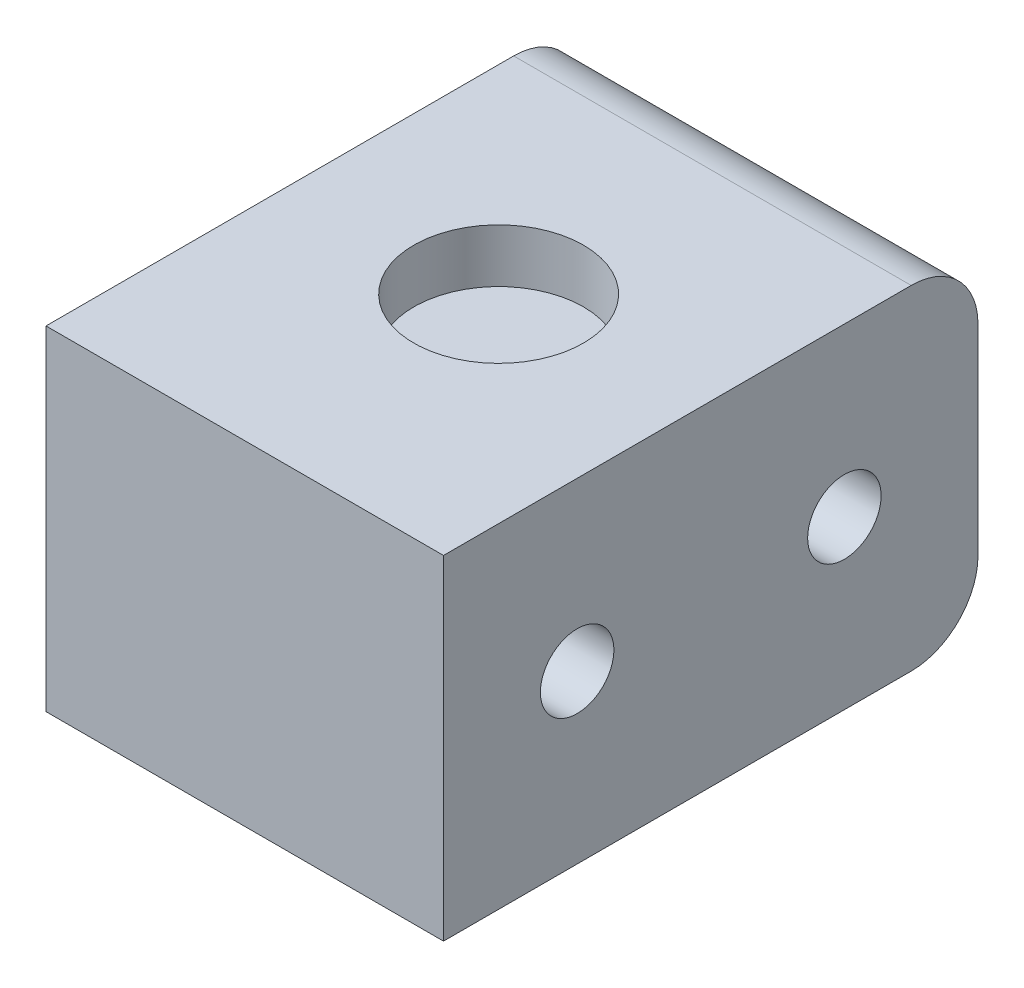
ISO-10303-21;
HEADER;
FILE_DESCRIPTION(('STEP AP214'),'2;1');
FILE_NAME('part.step','',(''),(''),'','','');
FILE_SCHEMA(('AUTOMOTIVE_DESIGN { 1 0 10303 214 1 1 1 1 }'));
ENDSEC;
DATA;
#1=APPLICATION_CONTEXT('core data for automotive mechanical design processes');
#2=APPLICATION_PROTOCOL_DEFINITION('international standard','automotive_design',2000,#1);
#3=PRODUCT_CONTEXT('',#1,'mechanical');
#4=PRODUCT('Part','Part','',(#3));
#5=PRODUCT_RELATED_PRODUCT_CATEGORY('part','',(#4));
#6=PRODUCT_DEFINITION_FORMATION('','',#4);
#7=PRODUCT_DEFINITION_CONTEXT('part definition',#1,'design');
#8=PRODUCT_DEFINITION('design','',#6,#7);
#9=PRODUCT_DEFINITION_SHAPE('','',#8);
#10=(LENGTH_UNIT() NAMED_UNIT(*) SI_UNIT(.MILLI.,.METRE.));
#11=(NAMED_UNIT(*) PLANE_ANGLE_UNIT() SI_UNIT($,.RADIAN.));
#12=(NAMED_UNIT(*) SI_UNIT($,.STERADIAN.) SOLID_ANGLE_UNIT());
#13=UNCERTAINTY_MEASURE_WITH_UNIT(LENGTH_MEASURE(1.E-05),#10,'distance_accuracy_value','');
#14=(GEOMETRIC_REPRESENTATION_CONTEXT(3) GLOBAL_UNCERTAINTY_ASSIGNED_CONTEXT((#13)) GLOBAL_UNIT_ASSIGNED_CONTEXT((#10,
#11,#12)) REPRESENTATION_CONTEXT('',''));
#15=CARTESIAN_POINT('',(0.,0.,0.));
#16=DIRECTION('',(0.,0.,1.));
#17=DIRECTION('',(1.,0.,0.));
#18=AXIS2_PLACEMENT_3D('',#15,#16,#17);
#19=CARTESIAN_POINT('',(0.,100.,0.));
#20=DIRECTION('',(1.,0.,0.));
#21=DIRECTION('',(0.,1.,0.));
#22=AXIS2_PLACEMENT_3D('',#19,#20,#21);
#23=PLANE('',#22);
#24=CARTESIAN_POINT('',(0.,87.5,-30.));
#25=DIRECTION('',(-1.,0.,0.));
#26=DIRECTION('',(0.,0.,1.));
#27=AXIS2_PLACEMENT_3D('',#24,#25,#26);
#28=CIRCLE('',#27,2.74999999999999);
#29=CARTESIAN_POINT('',(0.,87.5,-27.25));
#30=VERTEX_POINT('',#29);
#31=EDGE_CURVE('E160',#30,#30,#28,.T.);
#32=ORIENTED_EDGE('',*,*,#31,.T.);
#33=EDGE_LOOP('',(#32));
#34=FACE_BOUND('',#33,.T.);
#35=CARTESIAN_POINT('',(0.,87.5,-10.));
#36=DIRECTION('',(-1.,0.,0.));
#37=DIRECTION('',(0.,0.,1.));
#38=AXIS2_PLACEMENT_3D('',#35,#36,#37);
#39=CIRCLE('',#38,2.74999999999999);
#40=CARTESIAN_POINT('',(0.,87.5,-7.25000000000001));
#41=VERTEX_POINT('',#40);
#42=EDGE_CURVE('E154',#41,#41,#39,.T.);
#43=ORIENTED_EDGE('',*,*,#42,.T.);
#44=EDGE_LOOP('',(#43));
#45=FACE_BOUND('',#44,.T.);
#46=DIRECTION('',(0.,1.,0.));
#47=VECTOR('',#46,1.);
#48=CARTESIAN_POINT('',(0.,100.,-40.));
#49=LINE('',#48,#47);
#50=CARTESIAN_POINT('',(0.,80.,-40.));
#51=VERTEX_POINT('',#50);
#52=CARTESIAN_POINT('',(0.,95.,-40.));
#53=VERTEX_POINT('',#52);
#54=EDGE_CURVE('E137',#51,#53,#49,.T.);
#55=ORIENTED_EDGE('',*,*,#54,.T.);
#56=CARTESIAN_POINT('',(0.,95.,-35.));
#57=DIRECTION('',(-1.,0.,0.));
#58=DIRECTION('',(0.,1.,0.));
#59=AXIS2_PLACEMENT_3D('',#56,#57,#58);
#60=CIRCLE('',#59,5.);
#61=CARTESIAN_POINT('',(0.,100.,-35.));
#62=VERTEX_POINT('',#61);
#63=EDGE_CURVE('E110',#62,#53,#60,.T.);
#64=ORIENTED_EDGE('',*,*,#63,.F.);
#65=DIRECTION('',(0.,0.,-1.));
#66=VECTOR('',#65,1.);
#67=CARTESIAN_POINT('',(0.,100.,0.));
#68=LINE('',#67,#66);
#69=CARTESIAN_POINT('',(0.,100.,0.));
#70=VERTEX_POINT('',#69);
#71=EDGE_CURVE('E90',#70,#62,#68,.T.);
#72=ORIENTED_EDGE('',*,*,#71,.F.);
#73=DIRECTION('',(0.,1.,0.));
#74=VECTOR('',#73,1.);
#75=CARTESIAN_POINT('',(0.,100.,0.));
#76=LINE('',#75,#74);
#77=CARTESIAN_POINT('',(0.,75.,0.));
#78=VERTEX_POINT('',#77);
#79=EDGE_CURVE('E97',#78,#70,#76,.T.);
#80=ORIENTED_EDGE('',*,*,#79,.F.);
#81=DIRECTION('',(0.,0.,-1.));
#82=VECTOR('',#81,1.);
#83=CARTESIAN_POINT('',(0.,75.,0.));
#84=LINE('',#83,#82);
#85=CARTESIAN_POINT('',(0.,75.,-35.));
#86=VERTEX_POINT('',#85);
#87=EDGE_CURVE('E120',#78,#86,#84,.T.);
#88=ORIENTED_EDGE('',*,*,#87,.T.);
#89=CARTESIAN_POINT('',(0.,80.,-35.));
#90=DIRECTION('',(-1.,0.,0.));
#91=DIRECTION('',(0.,1.,0.));
#92=AXIS2_PLACEMENT_3D('',#89,#90,#91);
#93=CIRCLE('',#92,5.);
#94=EDGE_CURVE('E123',#51,#86,#93,.T.);
#95=ORIENTED_EDGE('',*,*,#94,.F.);
#96=EDGE_LOOP('',(#55,#64,#72,#80,#88,#95));
#97=FACE_BOUND('',#96,.T.);
#98=ADVANCED_FACE('F36',(#34,#45,#97),#23,.T.);
#99=CARTESIAN_POINT('',(0.,75.,0.));
#100=DIRECTION('',(0.,-1.,0.));
#101=DIRECTION('',(0.,0.,1.));
#102=AXIS2_PLACEMENT_3D('',#99,#100,#101);
#103=PLANE('',#102);
#104=ORIENTED_EDGE('',*,*,#87,.F.);
#105=DIRECTION('',(1.,0.,0.));
#106=VECTOR('',#105,1.);
#107=CARTESIAN_POINT('',(0.,75.,0.));
#108=LINE('',#107,#106);
#109=CARTESIAN_POINT('',(-29.75,75.,0.));
#110=VERTEX_POINT('',#109);
#111=EDGE_CURVE('E102',#110,#78,#108,.T.);
#112=ORIENTED_EDGE('',*,*,#111,.F.);
#113=DIRECTION('',(0.,0.,-1.));
#114=VECTOR('',#113,1.);
#115=CARTESIAN_POINT('',(-29.75,75.,0.));
#116=LINE('',#115,#114);
#117=CARTESIAN_POINT('',(-29.75,75.,-35.));
#118=VERTEX_POINT('',#117);
#119=EDGE_CURVE('E112',#110,#118,#116,.T.);
#120=ORIENTED_EDGE('',*,*,#119,.T.);
#121=DIRECTION('',(1.,0.,0.));
#122=VECTOR('',#121,1.);
#123=CARTESIAN_POINT('',(-29.75,75.,-35.));
#124=LINE('',#123,#122);
#125=EDGE_CURVE('E126',#86,#118,#124,.F.);
#126=ORIENTED_EDGE('',*,*,#125,.F.);
#127=EDGE_LOOP('',(#104,#112,#120,#126));
#128=FACE_BOUND('',#127,.T.);
#129=ADVANCED_FACE('F143',(#128),#103,.T.);
#130=CARTESIAN_POINT('',(-29.75,100.,0.));
#131=DIRECTION('',(-1.,0.,0.));
#132=DIRECTION('',(0.,0.,-1.));
#133=AXIS2_PLACEMENT_3D('',#130,#131,#132);
#134=PLANE('',#133);
#135=CARTESIAN_POINT('',(-29.75,87.5,-30.));
#136=DIRECTION('',(-1.,0.,0.));
#137=DIRECTION('',(0.,0.,1.));
#138=AXIS2_PLACEMENT_3D('',#135,#136,#137);
#139=CIRCLE('',#138,2.74999999999999);
#140=CARTESIAN_POINT('',(-29.75,87.5,-27.25));
#141=VERTEX_POINT('',#140);
#142=EDGE_CURVE('E157',#141,#141,#139,.T.);
#143=ORIENTED_EDGE('',*,*,#142,.F.);
#144=EDGE_LOOP('',(#143));
#145=FACE_BOUND('',#144,.T.);
#146=CARTESIAN_POINT('',(-29.75,87.5,-10.));
#147=DIRECTION('',(-1.,0.,0.));
#148=DIRECTION('',(0.,0.,1.));
#149=AXIS2_PLACEMENT_3D('',#146,#147,#148);
#150=CIRCLE('',#149,2.74999999999999);
#151=CARTESIAN_POINT('',(-29.75,87.5,-7.25000000000001));
#152=VERTEX_POINT('',#151);
#153=EDGE_CURVE('E149',#152,#152,#150,.T.);
#154=ORIENTED_EDGE('',*,*,#153,.F.);
#155=EDGE_LOOP('',(#154));
#156=FACE_BOUND('',#155,.T.);
#157=ORIENTED_EDGE('',*,*,#119,.F.);
#158=DIRECTION('',(0.,-1.,0.));
#159=VECTOR('',#158,1.);
#160=CARTESIAN_POINT('',(-29.75,100.,0.));
#161=LINE('',#160,#159);
#162=CARTESIAN_POINT('',(-29.75,100.,0.));
#163=VERTEX_POINT('',#162);
#164=EDGE_CURVE('E96',#163,#110,#161,.T.);
#165=ORIENTED_EDGE('',*,*,#164,.F.);
#166=DIRECTION('',(0.,0.,-1.));
#167=VECTOR('',#166,1.);
#168=CARTESIAN_POINT('',(-29.75,100.,0.));
#169=LINE('',#168,#167);
#170=CARTESIAN_POINT('',(-29.75,100.,-35.));
#171=VERTEX_POINT('',#170);
#172=EDGE_CURVE('E93',#163,#171,#169,.T.);
#173=ORIENTED_EDGE('',*,*,#172,.T.);
#174=CARTESIAN_POINT('',(-29.75,95.,-35.));
#175=DIRECTION('',(1.,0.,0.));
#176=DIRECTION('',(0.,0.,-1.));
#177=AXIS2_PLACEMENT_3D('',#174,#175,#176);
#178=CIRCLE('',#177,5.);
#179=CARTESIAN_POINT('',(-29.75,95.,-40.));
#180=VERTEX_POINT('',#179);
#181=EDGE_CURVE('E128',#180,#171,#178,.T.);
#182=ORIENTED_EDGE('',*,*,#181,.F.);
#183=DIRECTION('',(0.,-1.,0.));
#184=VECTOR('',#183,1.);
#185=CARTESIAN_POINT('',(-29.75,100.,-40.));
#186=LINE('',#185,#184);
#187=CARTESIAN_POINT('',(-29.75,80.,-40.));
#188=VERTEX_POINT('',#187);
#189=EDGE_CURVE('E106',#180,#188,#186,.T.);
#190=ORIENTED_EDGE('',*,*,#189,.T.);
#191=CARTESIAN_POINT('',(-29.75,80.,-35.));
#192=DIRECTION('',(1.,0.,0.));
#193=DIRECTION('',(0.,0.,-1.));
#194=AXIS2_PLACEMENT_3D('',#191,#192,#193);
#195=CIRCLE('',#194,5.);
#196=EDGE_CURVE('E44',#118,#188,#195,.T.);
#197=ORIENTED_EDGE('',*,*,#196,.F.);
#198=EDGE_LOOP('',(#157,#165,#173,#182,#190,#197));
#199=FACE_BOUND('',#198,.T.);
#200=ADVANCED_FACE('F135',(#145,#156,#199),#134,.T.);
#201=CARTESIAN_POINT('',(0.,100.,0.));
#202=DIRECTION('',(0.,1.,0.));
#203=DIRECTION('',(0.,0.,-1.));
#204=AXIS2_PLACEMENT_3D('',#201,#202,#203);
#205=PLANE('',#204);
#206=CARTESIAN_POINT('',(-14.875,100.,-19.));
#207=DIRECTION('',(0.,-1.,0.));
#208=DIRECTION('',(0.,0.,-1.));
#209=AXIS2_PLACEMENT_3D('',#206,#207,#208);
#210=CIRCLE('',#209,6.35);
#211=CARTESIAN_POINT('',(-14.875,100.,-25.35));
#212=VERTEX_POINT('',#211);
#213=EDGE_CURVE('E146',#212,#212,#210,.T.);
#214=ORIENTED_EDGE('',*,*,#213,.T.);
#215=EDGE_LOOP('',(#214));
#216=FACE_BOUND('',#215,.T.);
#217=ORIENTED_EDGE('',*,*,#172,.F.);
#218=DIRECTION('',(-1.,0.,0.));
#219=VECTOR('',#218,1.);
#220=CARTESIAN_POINT('',(0.,100.,0.));
#221=LINE('',#220,#219);
#222=EDGE_CURVE('E86',#70,#163,#221,.T.);
#223=ORIENTED_EDGE('',*,*,#222,.F.);
#224=ORIENTED_EDGE('',*,*,#71,.T.);
#225=DIRECTION('',(-1.,0.,0.));
#226=VECTOR('',#225,1.);
#227=CARTESIAN_POINT('',(0.,100.,-35.));
#228=LINE('',#227,#226);
#229=EDGE_CURVE('E11',#171,#62,#228,.F.);
#230=ORIENTED_EDGE('',*,*,#229,.F.);
#231=EDGE_LOOP('',(#217,#223,#224,#230));
#232=FACE_BOUND('',#231,.T.);
#233=ADVANCED_FACE('F88',(#216,#232),#205,.T.);
#234=CARTESIAN_POINT('',(0.,0.,0.));
#235=DIRECTION('',(0.,0.,1.));
#236=DIRECTION('',(-1.,0.,0.));
#237=AXIS2_PLACEMENT_3D('',#234,#235,#236);
#238=PLANE('',#237);
#239=ORIENTED_EDGE('',*,*,#79,.T.);
#240=ORIENTED_EDGE('',*,*,#222,.T.);
#241=ORIENTED_EDGE('',*,*,#164,.T.);
#242=ORIENTED_EDGE('',*,*,#111,.T.);
#243=EDGE_LOOP('',(#239,#240,#241,#242));
#244=FACE_BOUND('',#243,.T.);
#245=ADVANCED_FACE('F100',(#244),#238,.T.);
#246=CARTESIAN_POINT('',(0.,0.,-40.));
#247=DIRECTION('',(0.,0.,1.));
#248=DIRECTION('',(-1.,0.,0.));
#249=AXIS2_PLACEMENT_3D('',#246,#247,#248);
#250=PLANE('',#249);
#251=ORIENTED_EDGE('',*,*,#189,.F.);
#252=DIRECTION('',(-1.,0.,0.));
#253=VECTOR('',#252,1.);
#254=CARTESIAN_POINT('',(-29.75,95.,-40.));
#255=LINE('',#254,#253);
#256=EDGE_CURVE('E117',#53,#180,#255,.T.);
#257=ORIENTED_EDGE('',*,*,#256,.F.);
#258=ORIENTED_EDGE('',*,*,#54,.F.);
#259=DIRECTION('',(1.,0.,0.));
#260=VECTOR('',#259,1.);
#261=CARTESIAN_POINT('',(0.,80.,-40.));
#262=LINE('',#261,#260);
#263=EDGE_CURVE('E119',#188,#51,#262,.T.);
#264=ORIENTED_EDGE('',*,*,#263,.F.);
#265=EDGE_LOOP('',(#251,#257,#258,#264));
#266=FACE_BOUND('',#265,.T.);
#267=ADVANCED_FACE('F191',(#266),#250,.F.);
#268=CARTESIAN_POINT('',(-14.875,96.,-19.));
#269=DIRECTION('',(0.,1.,0.));
#270=DIRECTION('',(0.,0.,-1.));
#271=AXIS2_PLACEMENT_3D('',#268,#269,#270);
#272=CYLINDRICAL_SURFACE('',#271,6.35);
#273=CARTESIAN_POINT('',(-14.875,96.,-19.));
#274=DIRECTION('',(0.,-1.,0.));
#275=DIRECTION('',(0.,0.,-1.));
#276=AXIS2_PLACEMENT_3D('',#273,#274,#275);
#277=CIRCLE('',#276,6.35);
#278=CARTESIAN_POINT('',(-14.875,96.,-25.35));
#279=VERTEX_POINT('',#278);
#280=EDGE_CURVE('E139',#279,#279,#277,.T.);
#281=ORIENTED_EDGE('',*,*,#280,.T.);
#282=EDGE_LOOP('',(#281));
#283=FACE_BOUND('',#282,.T.);
#284=ORIENTED_EDGE('',*,*,#213,.F.);
#285=EDGE_LOOP('',(#284));
#286=FACE_BOUND('',#285,.T.);
#287=ADVANCED_FACE('F194',(#283,#286),#272,.F.);
#288=CARTESIAN_POINT('',(-14.875,96.,-19.));
#289=DIRECTION('',(0.,1.,0.));
#290=DIRECTION('',(0.,0.,-1.));
#291=AXIS2_PLACEMENT_3D('',#288,#289,#290);
#292=PLANE('',#291);
#293=ORIENTED_EDGE('',*,*,#280,.F.);
#294=EDGE_LOOP('',(#293));
#295=FACE_BOUND('',#294,.T.);
#296=ADVANCED_FACE('F175',(#295),#292,.T.);
#297=CARTESIAN_POINT('',(0.,87.5,-10.));
#298=DIRECTION('',(1.,0.,0.));
#299=DIRECTION('',(0.,0.,1.));
#300=AXIS2_PLACEMENT_3D('',#297,#298,#299);
#301=CYLINDRICAL_SURFACE('',#300,2.74999999999999);
#302=ORIENTED_EDGE('',*,*,#153,.T.);
#303=EDGE_LOOP('',(#302));
#304=FACE_BOUND('',#303,.T.);
#305=ORIENTED_EDGE('',*,*,#42,.F.);
#306=EDGE_LOOP('',(#305));
#307=FACE_BOUND('',#306,.T.);
#308=ADVANCED_FACE('F168',(#304,#307),#301,.F.);
#309=CARTESIAN_POINT('',(0.,87.5,-30.));
#310=DIRECTION('',(1.,0.,0.));
#311=DIRECTION('',(0.,0.,1.));
#312=AXIS2_PLACEMENT_3D('',#309,#310,#311);
#313=CYLINDRICAL_SURFACE('',#312,2.74999999999999);
#314=ORIENTED_EDGE('',*,*,#142,.T.);
#315=EDGE_LOOP('',(#314));
#316=FACE_BOUND('',#315,.T.);
#317=ORIENTED_EDGE('',*,*,#31,.F.);
#318=EDGE_LOOP('',(#317));
#319=FACE_BOUND('',#318,.T.);
#320=ADVANCED_FACE('F166',(#316,#319),#313,.F.);
#321=CARTESIAN_POINT('',(0.,80.,-35.));
#322=DIRECTION('',(-1.,0.,0.));
#323=DIRECTION('',(0.,0.,-1.));
#324=AXIS2_PLACEMENT_3D('',#321,#322,#323);
#325=CYLINDRICAL_SURFACE('',#324,5.);
#326=ORIENTED_EDGE('',*,*,#196,.T.);
#327=ORIENTED_EDGE('',*,*,#263,.T.);
#328=ORIENTED_EDGE('',*,*,#94,.T.);
#329=ORIENTED_EDGE('',*,*,#125,.T.);
#330=EDGE_LOOP('',(#326,#327,#328,#329));
#331=FACE_BOUND('',#330,.T.);
#332=ADVANCED_FACE('F130',(#331),#325,.T.);
#333=CARTESIAN_POINT('',(0.,95.,-35.));
#334=DIRECTION('',(1.,0.,0.));
#335=DIRECTION('',(0.,0.,1.));
#336=AXIS2_PLACEMENT_3D('',#333,#334,#335);
#337=CYLINDRICAL_SURFACE('',#336,5.);
#338=ORIENTED_EDGE('',*,*,#63,.T.);
#339=ORIENTED_EDGE('',*,*,#256,.T.);
#340=ORIENTED_EDGE('',*,*,#181,.T.);
#341=ORIENTED_EDGE('',*,*,#229,.T.);
#342=EDGE_LOOP('',(#338,#339,#340,#341));
#343=FACE_BOUND('',#342,.T.);
#344=ADVANCED_FACE('F38',(#343),#337,.T.);
#345=CLOSED_SHELL('',(#98,#129,#200,#233,#245,#267,#287,#296,#308,#320,#332,#344));
#346=MANIFOLD_SOLID_BREP('B2',#345);
#347=ADVANCED_BREP_SHAPE_REPRESENTATION('',(#18,#346),#14);
#348=SHAPE_DEFINITION_REPRESENTATION(#9,#347);
ENDSEC;
END-ISO-10303-21;
